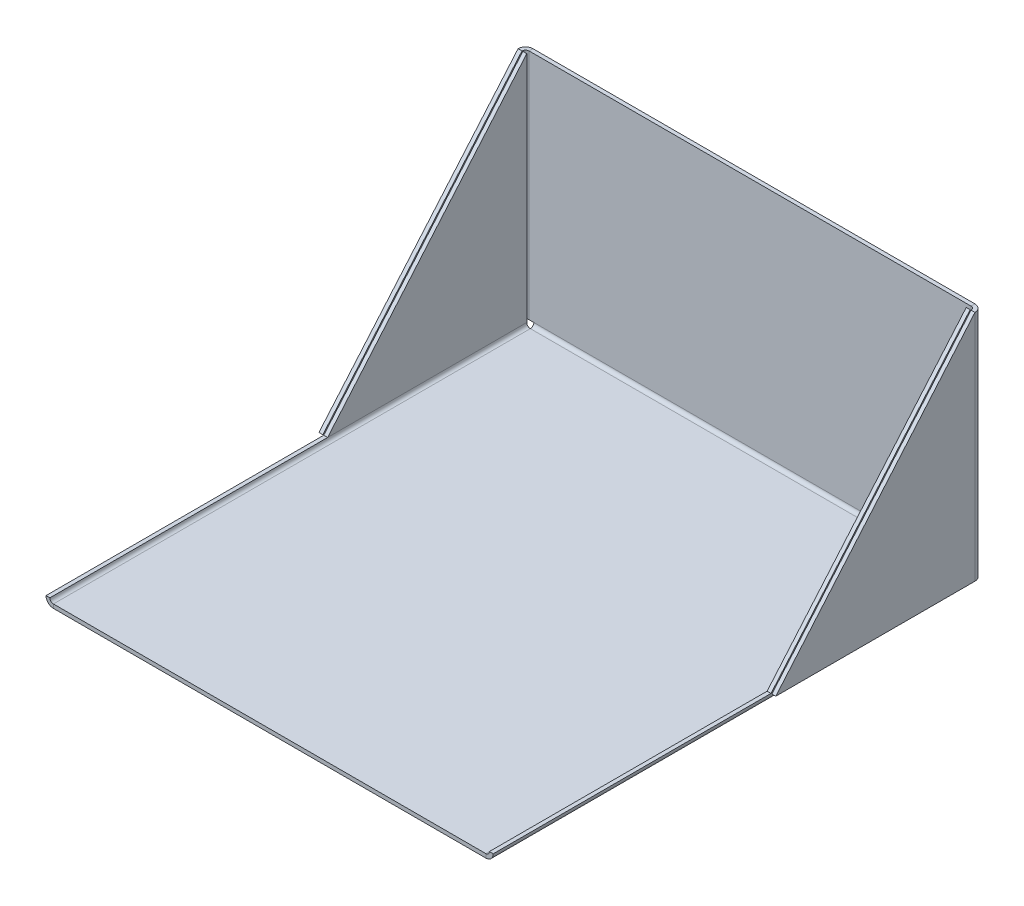
ISO-10303-21;
HEADER;
FILE_DESCRIPTION(('STEP AP214'),'2;1');
FILE_NAME('part.step','',(''),(''),'','','');
FILE_SCHEMA(('AUTOMOTIVE_DESIGN { 1 0 10303 214 1 1 1 1 }'));
ENDSEC;
DATA;
#1=APPLICATION_CONTEXT('core data for automotive mechanical design processes');
#2=APPLICATION_PROTOCOL_DEFINITION('international standard','automotive_design',2000,#1);
#3=PRODUCT_CONTEXT('',#1,'mechanical');
#4=PRODUCT('Part','Part','',(#3));
#5=PRODUCT_RELATED_PRODUCT_CATEGORY('part','',(#4));
#6=PRODUCT_DEFINITION_FORMATION('','',#4);
#7=PRODUCT_DEFINITION_CONTEXT('part definition',#1,'design');
#8=PRODUCT_DEFINITION('design','',#6,#7);
#9=PRODUCT_DEFINITION_SHAPE('','',#8);
#10=(LENGTH_UNIT() NAMED_UNIT(*) SI_UNIT(.MILLI.,.METRE.));
#11=(NAMED_UNIT(*) PLANE_ANGLE_UNIT() SI_UNIT($,.RADIAN.));
#12=(NAMED_UNIT(*) SI_UNIT($,.STERADIAN.) SOLID_ANGLE_UNIT());
#13=UNCERTAINTY_MEASURE_WITH_UNIT(LENGTH_MEASURE(1.E-05),#10,'distance_accuracy_value','');
#14=(GEOMETRIC_REPRESENTATION_CONTEXT(3) GLOBAL_UNCERTAINTY_ASSIGNED_CONTEXT((#13)) GLOBAL_UNIT_ASSIGNED_CONTEXT((#10,
#11,#12)) REPRESENTATION_CONTEXT('',''));
#15=CARTESIAN_POINT('',(0.,0.,0.));
#16=DIRECTION('',(0.,0.,1.));
#17=DIRECTION('',(1.,0.,0.));
#18=AXIS2_PLACEMENT_3D('',#15,#16,#17);
#19=CARTESIAN_POINT('',(-2.54660000000035,0.,0.));
#20=DIRECTION('',(1.,0.,0.));
#21=DIRECTION('',(0.,0.,-1.));
#22=AXIS2_PLACEMENT_3D('',#19,#20,#21);
#23=PLANE('',#22);
#24=DIRECTION('',(0.,0.759861353154798,-0.650085166714147));
#25=VECTOR('',#24,1.);
#26=CARTESIAN_POINT('',(-2.54660000000023,-28.2453762455963,-33.0150123603461));
#27=LINE('',#26,#25);
#28=CARTESIAN_POINT('',(-2.54660000000014,0.736600000000137,-57.8100000000001));
#29=VERTEX_POINT('',#28);
#30=CARTESIAN_POINT('',(-2.5466,49.19,-99.2634000000002));
#31=VERTEX_POINT('',#30);
#32=EDGE_CURVE('E309',#29,#31,#27,.T.);
#33=ORIENTED_EDGE('',*,*,#32,.T.);
#34=DIRECTION('',(0.,-1.,0.));
#35=VECTOR('',#34,1.);
#36=CARTESIAN_POINT('',(-2.5466,49.1900000000001,-99.2634000000002));
#37=LINE('',#36,#35);
#38=CARTESIAN_POINT('',(-2.5466,0.736599999999997,-99.2634000000001));
#39=VERTEX_POINT('',#38);
#40=EDGE_CURVE('E321',#39,#31,#37,.F.);
#41=ORIENTED_EDGE('',*,*,#40,.F.);
#42=DIRECTION('',(0.,0.,1.));
#43=VECTOR('',#42,1.);
#44=CARTESIAN_POINT('',(-2.54660000000035,0.736600000000332,0.));
#45=LINE('',#44,#43);
#46=EDGE_CURVE('E323',#39,#29,#45,.T.);
#47=ORIENTED_EDGE('',*,*,#46,.T.);
#48=EDGE_LOOP('',(#33,#41,#47));
#49=FACE_BOUND('',#48,.T.);
#50=ADVANCED_FACE('F117',(#49),#23,.F.);
#51=CARTESIAN_POINT('',(-1.73660000000035,0.,0.));
#52=DIRECTION('',(1.,0.,0.));
#53=DIRECTION('',(0.,0.,-1.));
#54=AXIS2_PLACEMENT_3D('',#51,#52,#53);
#55=PLANE('',#54);
#56=DIRECTION('',(0.,-1.,0.));
#57=VECTOR('',#56,1.);
#58=CARTESIAN_POINT('',(-1.7366,49.1900000000001,-99.2634000000002));
#59=LINE('',#58,#57);
#60=CARTESIAN_POINT('',(-1.73660000000006,49.19,-99.2634000000002));
#61=VERTEX_POINT('',#60);
#62=CARTESIAN_POINT('',(-1.7366,0.736599999999996,-99.2634000000002));
#63=VERTEX_POINT('',#62);
#64=EDGE_CURVE('E316',#61,#63,#59,.T.);
#65=ORIENTED_EDGE('',*,*,#64,.F.);
#66=DIRECTION('',(0.,0.759861353154798,-0.650085166714147));
#67=VECTOR('',#66,1.);
#68=CARTESIAN_POINT('',(-1.73660000000023,-28.2453762455963,-33.0150123603461));
#69=LINE('',#68,#67);
#70=CARTESIAN_POINT('',(-1.73660000000014,0.736600000000136,-57.8100000000001));
#71=VERTEX_POINT('',#70);
#72=EDGE_CURVE('E312',#71,#61,#69,.T.);
#73=ORIENTED_EDGE('',*,*,#72,.F.);
#74=DIRECTION('',(0.,0.,-1.));
#75=VECTOR('',#74,1.);
#76=CARTESIAN_POINT('',(-1.73660000000014,0.736600000000138,-57.8100000000001));
#77=LINE('',#76,#75);
#78=EDGE_CURVE('E331',#63,#71,#77,.F.);
#79=ORIENTED_EDGE('',*,*,#78,.F.);
#80=EDGE_LOOP('',(#65,#73,#79));
#81=FACE_BOUND('',#80,.T.);
#82=ADVANCED_FACE('F527',(#81),#55,.T.);
#83=CARTESIAN_POINT('',(91.5465999999999,-3.07524396539059E-13,1.02391357888355E-13));
#84=DIRECTION('',(-1.,0.,0.));
#85=DIRECTION('',(0.,-1.,0.));
#86=AXIS2_PLACEMENT_3D('',#83,#84,#85);
#87=PLANE('',#86);
#88=DIRECTION('',(0.,-0.759861353154798,0.650085166714147));
#89=VECTOR('',#88,1.);
#90=CARTESIAN_POINT('',(91.5465999999998,-28.2453762455964,-33.0150123603457));
#91=LINE('',#90,#89);
#92=CARTESIAN_POINT('',(91.5466000000001,49.19,-99.2634000000001));
#93=VERTEX_POINT('',#92);
#94=CARTESIAN_POINT('',(91.5466,0.736600000000137,-57.8099999999998));
#95=VERTEX_POINT('',#94);
#96=EDGE_CURVE('E325',#93,#95,#91,.T.);
#97=ORIENTED_EDGE('',*,*,#96,.T.);
#98=DIRECTION('',(0.,0.,-1.));
#99=VECTOR('',#98,1.);
#100=CARTESIAN_POINT('',(91.5465999999999,0.736600000000001,0.));
#101=LINE('',#100,#99);
#102=CARTESIAN_POINT('',(91.5466,0.736600000000001,-99.2634000000001));
#103=VERTEX_POINT('',#102);
#104=EDGE_CURVE('E561',#103,#95,#101,.F.);
#105=ORIENTED_EDGE('',*,*,#104,.F.);
#106=DIRECTION('',(0.,1.,0.));
#107=VECTOR('',#106,1.);
#108=CARTESIAN_POINT('',(91.5466,-2.79519590637815E-13,-99.2634000000001));
#109=LINE('',#108,#107);
#110=EDGE_CURVE('E429',#103,#93,#109,.T.);
#111=ORIENTED_EDGE('',*,*,#110,.T.);
#112=EDGE_LOOP('',(#97,#105,#111));
#113=FACE_BOUND('',#112,.T.);
#114=ADVANCED_FACE('F585',(#113),#87,.F.);
#115=CARTESIAN_POINT('',(90.7365999999999,-3.04696296654596E-13,1.01485403981934E-13));
#116=DIRECTION('',(-1.,0.,0.));
#117=DIRECTION('',(0.,-1.,0.));
#118=AXIS2_PLACEMENT_3D('',#115,#116,#117);
#119=PLANE('',#118);
#120=DIRECTION('',(0.,0.,-1.));
#121=VECTOR('',#120,1.);
#122=CARTESIAN_POINT('',(90.7365999999999,0.736600000000004,0.));
#123=LINE('',#122,#121);
#124=CARTESIAN_POINT('',(90.7365999999999,0.73660000000014,-57.8099999999998));
#125=VERTEX_POINT('',#124);
#126=CARTESIAN_POINT('',(90.7365999999999,0.736600000000004,-99.2634000000001));
#127=VERTEX_POINT('',#126);
#128=EDGE_CURVE('E424',#125,#127,#123,.T.);
#129=ORIENTED_EDGE('',*,*,#128,.F.);
#130=DIRECTION('',(0.,-0.759861353154798,0.650085166714147));
#131=VECTOR('',#130,1.);
#132=CARTESIAN_POINT('',(90.7365999999998,-28.2453762455964,-33.0150123603457));
#133=LINE('',#132,#131);
#134=CARTESIAN_POINT('',(90.7366000000001,49.19,-99.2634000000001));
#135=VERTEX_POINT('',#134);
#136=EDGE_CURVE('E530',#135,#125,#133,.T.);
#137=ORIENTED_EDGE('',*,*,#136,.F.);
#138=DIRECTION('',(0.,-1.,0.));
#139=VECTOR('',#138,1.);
#140=CARTESIAN_POINT('',(90.7366000000001,49.19,-99.2634000000001));
#141=LINE('',#140,#139);
#142=EDGE_CURVE('E558',#127,#135,#141,.F.);
#143=ORIENTED_EDGE('',*,*,#142,.F.);
#144=EDGE_LOOP('',(#129,#137,#143));
#145=FACE_BOUND('',#144,.T.);
#146=ADVANCED_FACE('F592',(#145),#119,.T.);
#147=CARTESIAN_POINT('',(-1.5466,0.,0.));
#148=DIRECTION('',(1.,0.,0.));
#149=DIRECTION('',(0.,1.,0.));
#150=AXIS2_PLACEMENT_3D('',#147,#148,#149);
#151=PLANE('',#150);
#152=DIRECTION('',(0.,0.759861353154798,-0.650085166714147));
#153=VECTOR('',#152,1.);
#154=CARTESIAN_POINT('',(-1.5465999999999,-28.2453762455963,-33.0150123603461));
#155=LINE('',#154,#153);
#156=CARTESIAN_POINT('',(-1.54660000000009,0.736600000000137,-57.8100000000001));
#157=VERTEX_POINT('',#156);
#158=CARTESIAN_POINT('',(-1.54660000000017,49.19,-99.2634000000001));
#159=VERTEX_POINT('',#158);
#160=EDGE_CURVE('E540',#157,#159,#155,.T.);
#161=ORIENTED_EDGE('',*,*,#160,.T.);
#162=DIRECTION('',(0.,-1.,0.));
#163=VECTOR('',#162,1.);
#164=CARTESIAN_POINT('',(-1.5466,0.,-99.2634000000001));
#165=LINE('',#164,#163);
#166=CARTESIAN_POINT('',(-1.5466,0.736599999999988,-99.2634000000001));
#167=VERTEX_POINT('',#166);
#168=EDGE_CURVE('E437',#159,#167,#165,.T.);
#169=ORIENTED_EDGE('',*,*,#168,.T.);
#170=DIRECTION('',(0.,0.,1.));
#171=VECTOR('',#170,1.);
#172=CARTESIAN_POINT('',(-1.5466,0.736599999999989,-99.2634000000001));
#173=LINE('',#172,#171);
#174=EDGE_CURVE('E446',#157,#167,#173,.F.);
#175=ORIENTED_EDGE('',*,*,#174,.F.);
#176=EDGE_LOOP('',(#161,#169,#175));
#177=FACE_BOUND('',#176,.T.);
#178=ADVANCED_FACE('F594',(#177),#151,.F.);
#179=CARTESIAN_POINT('',(-0.736599999999997,0.,0.));
#180=DIRECTION('',(1.,0.,0.));
#181=DIRECTION('',(0.,1.,0.));
#182=AXIS2_PLACEMENT_3D('',#179,#180,#181);
#183=PLANE('',#182);
#184=DIRECTION('',(0.,1.,0.));
#185=VECTOR('',#184,1.);
#186=CARTESIAN_POINT('',(-0.736599999999997,0.,-99.2634000000001));
#187=LINE('',#186,#185);
#188=CARTESIAN_POINT('',(-0.736600000000169,49.19,-99.2634000000001));
#189=VERTEX_POINT('',#188);
#190=CARTESIAN_POINT('',(-0.7366,0.736599999999991,-99.2634000000001));
#191=VERTEX_POINT('',#190);
#192=EDGE_CURVE('E440',#189,#191,#187,.F.);
#193=ORIENTED_EDGE('',*,*,#192,.F.);
#194=DIRECTION('',(0.,0.759861353154798,-0.650085166714147));
#195=VECTOR('',#194,1.);
#196=CARTESIAN_POINT('',(-0.736599999999899,-28.2453762455963,-33.0150123603461));
#197=LINE('',#196,#195);
#198=CARTESIAN_POINT('',(-0.7366,0.73660000000014,-57.8100000000001));
#199=VERTEX_POINT('',#198);
#200=EDGE_CURVE('E541',#199,#189,#197,.T.);
#201=ORIENTED_EDGE('',*,*,#200,.F.);
#202=DIRECTION('',(0.,0.,1.));
#203=VECTOR('',#202,1.);
#204=CARTESIAN_POINT('',(-0.7366,0.736599999999992,-99.2634000000001));
#205=LINE('',#204,#203);
#206=EDGE_CURVE('E450',#191,#199,#205,.T.);
#207=ORIENTED_EDGE('',*,*,#206,.F.);
#208=EDGE_LOOP('',(#193,#201,#207));
#209=FACE_BOUND('',#208,.T.);
#210=ADVANCED_FACE('F600',(#209),#183,.T.);
#211=CARTESIAN_POINT('',(92.5466000000003,0.,-3.28474222893147E-13));
#212=DIRECTION('',(-1.,0.,0.));
#213=DIRECTION('',(0.,0.,1.));
#214=AXIS2_PLACEMENT_3D('',#211,#212,#213);
#215=PLANE('',#214);
#216=DIRECTION('',(0.,-0.759861353154798,0.650085166714147));
#217=VECTOR('',#216,1.);
#218=CARTESIAN_POINT('',(92.5466000000002,-28.245376245596,-33.015012360346));
#219=LINE('',#218,#217);
#220=CARTESIAN_POINT('',(92.5466,49.19,-99.2633999999998));
#221=VERTEX_POINT('',#220);
#222=CARTESIAN_POINT('',(92.5466000000001,0.736600000000141,-57.8100000000001));
#223=VERTEX_POINT('',#222);
#224=EDGE_CURVE('E551',#221,#223,#219,.T.);
#225=ORIENTED_EDGE('',*,*,#224,.T.);
#226=DIRECTION('',(0.,0.,-1.));
#227=VECTOR('',#226,1.);
#228=CARTESIAN_POINT('',(92.5466000000003,0.73660000000034,-3.31005058112816E-13));
#229=LINE('',#228,#227);
#230=CARTESIAN_POINT('',(92.5466,0.736599999999997,-99.2634000000002));
#231=VERTEX_POINT('',#230);
#232=EDGE_CURVE('E473',#223,#231,#229,.T.);
#233=ORIENTED_EDGE('',*,*,#232,.T.);
#234=DIRECTION('',(0.,1.,0.));
#235=VECTOR('',#234,1.);
#236=CARTESIAN_POINT('',(92.5466,0.736600000000069,-99.2634000000001));
#237=LINE('',#236,#235);
#238=EDGE_CURVE('E479',#221,#231,#237,.F.);
#239=ORIENTED_EDGE('',*,*,#238,.F.);
#240=EDGE_LOOP('',(#225,#233,#239));
#241=FACE_BOUND('',#240,.T.);
#242=ADVANCED_FACE('F709',(#241),#215,.F.);
#243=CARTESIAN_POINT('',(91.7366000000003,0.,-3.25646123008684E-13));
#244=DIRECTION('',(-1.,0.,0.));
#245=DIRECTION('',(0.,0.,1.));
#246=AXIS2_PLACEMENT_3D('',#243,#244,#245);
#247=PLANE('',#246);
#248=DIRECTION('',(0.,0.,1.));
#249=VECTOR('',#248,1.);
#250=CARTESIAN_POINT('',(91.7366,0.736599999999996,-100.));
#251=LINE('',#250,#249);
#252=CARTESIAN_POINT('',(91.7366000000001,0.736600000000141,-57.8100000000001));
#253=VERTEX_POINT('',#252);
#254=CARTESIAN_POINT('',(91.7366,0.736599999999997,-99.2634000000002));
#255=VERTEX_POINT('',#254);
#256=EDGE_CURVE('E476',#253,#255,#251,.F.);
#257=ORIENTED_EDGE('',*,*,#256,.F.);
#258=DIRECTION('',(0.,-0.759861353154798,0.650085166714147));
#259=VECTOR('',#258,1.);
#260=CARTESIAN_POINT('',(91.7366000000002,-28.245376245596,-33.015012360346));
#261=LINE('',#260,#259);
#262=CARTESIAN_POINT('',(91.7366,49.19,-99.2633999999998));
#263=VERTEX_POINT('',#262);
#264=EDGE_CURVE('E550',#263,#253,#261,.T.);
#265=ORIENTED_EDGE('',*,*,#264,.F.);
#266=DIRECTION('',(0.,1.,0.));
#267=VECTOR('',#266,1.);
#268=CARTESIAN_POINT('',(91.7366,0.736600000000069,-99.2634000000001));
#269=LINE('',#268,#267);
#270=EDGE_CURVE('E484',#255,#263,#269,.T.);
#271=ORIENTED_EDGE('',*,*,#270,.F.);
#272=EDGE_LOOP('',(#257,#265,#271));
#273=FACE_BOUND('',#272,.T.);
#274=ADVANCED_FACE('F658',(#273),#247,.T.);
#275=CARTESIAN_POINT('',(0.,-0.81,0.));
#276=DIRECTION('',(0.,-1.,0.));
#277=DIRECTION('',(0.,0.,-1.));
#278=AXIS2_PLACEMENT_3D('',#275,#276,#277);
#279=PLANE('',#278);
#280=DIRECTION('',(0.,0.,1.));
#281=VECTOR('',#280,1.);
#282=CARTESIAN_POINT('',(0.,-0.81,0.));
#283=LINE('',#282,#281);
#284=CARTESIAN_POINT('',(0.,-0.810000000000005,-99.2634000000001));
#285=VERTEX_POINT('',#284);
#286=CARTESIAN_POINT('',(0.,-0.809999999999996,0.));
#287=VERTEX_POINT('',#286);
#288=EDGE_CURVE('E394',#285,#287,#283,.T.);
#289=ORIENTED_EDGE('',*,*,#288,.F.);
#290=DIRECTION('',(-1.,0.,0.));
#291=VECTOR('',#290,1.);
#292=CARTESIAN_POINT('',(0.,-0.810000000000005,-99.2634000000001));
#293=LINE('',#292,#291);
#294=CARTESIAN_POINT('',(90.0000000000001,-0.809999999999942,-99.2634000000001));
#295=VERTEX_POINT('',#294);
#296=EDGE_CURVE('E153',#285,#295,#293,.F.);
#297=ORIENTED_EDGE('',*,*,#296,.T.);
#298=DIRECTION('',(0.,0.,-1.));
#299=VECTOR('',#298,1.);
#300=CARTESIAN_POINT('',(89.9999999999999,-0.81,0.));
#301=LINE('',#300,#299);
#302=CARTESIAN_POINT('',(89.9999999999999,-0.81,0.));
#303=VERTEX_POINT('',#302);
#304=EDGE_CURVE('E133',#303,#295,#301,.T.);
#305=ORIENTED_EDGE('',*,*,#304,.F.);
#306=DIRECTION('',(1.,0.,0.));
#307=VECTOR('',#306,1.);
#308=CARTESIAN_POINT('',(0.,-0.81,0.));
#309=LINE('',#308,#307);
#310=EDGE_CURVE('E397',#287,#303,#309,.T.);
#311=ORIENTED_EDGE('',*,*,#310,.F.);
#312=EDGE_LOOP('',(#289,#297,#305,#311));
#313=FACE_BOUND('',#312,.T.);
#314=ADVANCED_FACE('F656',(#313),#279,.T.);
#315=CARTESIAN_POINT('',(0.,0.,0.));
#316=DIRECTION('',(0.,-1.,0.));
#317=DIRECTION('',(0.,0.,-1.));
#318=AXIS2_PLACEMENT_3D('',#315,#316,#317);
#319=PLANE('',#318);
#320=DIRECTION('',(-1.,0.,0.));
#321=VECTOR('',#320,1.);
#322=CARTESIAN_POINT('',(0.,0.,-99.2634000000001));
#323=LINE('',#322,#321);
#324=CARTESIAN_POINT('',(0.,0.,-99.2634000000001));
#325=VERTEX_POINT('',#324);
#326=CARTESIAN_POINT('',(90.,0.,-99.2634000000001));
#327=VERTEX_POINT('',#326);
#328=EDGE_CURVE('E163',#325,#327,#323,.F.);
#329=ORIENTED_EDGE('',*,*,#328,.F.);
#330=DIRECTION('',(0.,0.,1.));
#331=VECTOR('',#330,1.);
#332=CARTESIAN_POINT('',(0.,0.,0.));
#333=LINE('',#332,#331);
#334=CARTESIAN_POINT('',(0.,0.,0.));
#335=VERTEX_POINT('',#334);
#336=EDGE_CURVE('E145',#325,#335,#333,.T.);
#337=ORIENTED_EDGE('',*,*,#336,.T.);
#338=DIRECTION('',(1.,0.,0.));
#339=VECTOR('',#338,1.);
#340=CARTESIAN_POINT('',(0.,0.,0.));
#341=LINE('',#340,#339);
#342=CARTESIAN_POINT('',(89.9999999999999,0.,0.));
#343=VERTEX_POINT('',#342);
#344=EDGE_CURVE('E402',#335,#343,#341,.T.);
#345=ORIENTED_EDGE('',*,*,#344,.T.);
#346=DIRECTION('',(0.,0.,-1.));
#347=VECTOR('',#346,1.);
#348=CARTESIAN_POINT('',(89.9999999999999,0.,0.));
#349=LINE('',#348,#347);
#350=EDGE_CURVE('E398',#343,#327,#349,.T.);
#351=ORIENTED_EDGE('',*,*,#350,.T.);
#352=EDGE_LOOP('',(#329,#337,#345,#351));
#353=FACE_BOUND('',#352,.T.);
#354=ADVANCED_FACE('F407',(#353),#319,.F.);
#355=CARTESIAN_POINT('',(0.,-0.81,0.));
#356=DIRECTION('',(0.,0.,1.));
#357=DIRECTION('',(1.,0.,0.));
#358=AXIS2_PLACEMENT_3D('',#355,#356,#357);
#359=PLANE('',#358);
#360=ORIENTED_EDGE('',*,*,#344,.F.);
#361=DIRECTION('',(0.,1.,0.));
#362=VECTOR('',#361,1.);
#363=CARTESIAN_POINT('',(0.,-0.81,0.));
#364=LINE('',#363,#362);
#365=EDGE_CURVE('E121',#287,#335,#364,.T.);
#366=ORIENTED_EDGE('',*,*,#365,.F.);
#367=ORIENTED_EDGE('',*,*,#310,.T.);
#368=DIRECTION('',(0.,1.,0.));
#369=VECTOR('',#368,1.);
#370=CARTESIAN_POINT('',(89.9999999999999,-0.81,0.));
#371=LINE('',#370,#369);
#372=EDGE_CURVE('E13',#303,#343,#371,.T.);
#373=ORIENTED_EDGE('',*,*,#372,.T.);
#374=EDGE_LOOP('',(#360,#366,#367,#373));
#375=FACE_BOUND('',#374,.T.);
#376=ADVANCED_FACE('F119',(#375),#359,.T.);
#377=CARTESIAN_POINT('',(90.,0.736599999999999,-99.2634000000001));
#378=DIRECTION('',(1.,0.,0.));
#379=DIRECTION('',(0.,0.,-1.));
#380=AXIS2_PLACEMENT_3D('',#377,#378,#379);
#381=PLANE('',#380);
#382=DIRECTION('',(0.,0.,-1.));
#383=VECTOR('',#382,1.);
#384=CARTESIAN_POINT('',(90.,0.736600000000004,-100.));
#385=LINE('',#384,#383);
#386=CARTESIAN_POINT('',(90.,0.736599999999997,-100.));
#387=VERTEX_POINT('',#386);
#388=CARTESIAN_POINT('',(90.,0.736599999999994,-100.81));
#389=VERTEX_POINT('',#388);
#390=EDGE_CURVE('E364',#387,#389,#385,.T.);
#391=ORIENTED_EDGE('',*,*,#390,.F.);
#392=CARTESIAN_POINT('',(90.,0.736599999999999,-99.2634000000001));
#393=DIRECTION('',(-1.,0.,0.));
#394=DIRECTION('',(0.,0.,1.));
#395=AXIS2_PLACEMENT_3D('',#392,#393,#394);
#396=CIRCLE('',#395,0.736600000000004);
#397=EDGE_CURVE('E386',#327,#387,#396,.F.);
#398=ORIENTED_EDGE('',*,*,#397,.F.);
#399=DIRECTION('',(0.,-1.,0.));
#400=VECTOR('',#399,1.);
#401=CARTESIAN_POINT('',(90.,0.,-99.2634000000001));
#402=LINE('',#401,#400);
#403=EDGE_CURVE('E390',#327,#295,#402,.T.);
#404=ORIENTED_EDGE('',*,*,#403,.T.);
#405=CARTESIAN_POINT('',(90.,0.736599999999999,-99.2634000000001));
#406=DIRECTION('',(-1.,0.,0.));
#407=DIRECTION('',(0.,0.,1.));
#408=AXIS2_PLACEMENT_3D('',#405,#406,#407);
#409=CIRCLE('',#408,1.5466);
#410=EDGE_CURVE('E381',#295,#389,#409,.F.);
#411=ORIENTED_EDGE('',*,*,#410,.T.);
#412=EDGE_LOOP('',(#391,#398,#404,#411));
#413=FACE_BOUND('',#412,.T.);
#414=ADVANCED_FACE('F651',(#413),#381,.T.);
#415=CARTESIAN_POINT('',(0.,0.736599999999999,-99.2634000000001));
#416=DIRECTION('',(1.,0.,0.));
#417=DIRECTION('',(0.,0.,-1.));
#418=AXIS2_PLACEMENT_3D('',#415,#416,#417);
#419=PLANE('',#418);
#420=CARTESIAN_POINT('',(0.,0.736599999999999,-99.2634000000001));
#421=DIRECTION('',(-1.,0.,0.));
#422=DIRECTION('',(0.,0.,1.));
#423=AXIS2_PLACEMENT_3D('',#420,#421,#422);
#424=CIRCLE('',#423,0.736600000000004);
#425=CARTESIAN_POINT('',(0.,0.736599999999997,-100.));
#426=VERTEX_POINT('',#425);
#427=EDGE_CURVE('E377',#426,#325,#424,.T.);
#428=ORIENTED_EDGE('',*,*,#427,.F.);
#429=DIRECTION('',(0.,0.,-1.));
#430=VECTOR('',#429,1.);
#431=CARTESIAN_POINT('',(0.,0.736600000000004,-100.));
#432=LINE('',#431,#430);
#433=CARTESIAN_POINT('',(0.,0.736599999999997,-100.81));
#434=VERTEX_POINT('',#433);
#435=EDGE_CURVE('E366',#426,#434,#432,.T.);
#436=ORIENTED_EDGE('',*,*,#435,.T.);
#437=CARTESIAN_POINT('',(0.,0.736599999999999,-99.2634000000001));
#438=DIRECTION('',(-1.,0.,0.));
#439=DIRECTION('',(0.,0.,1.));
#440=AXIS2_PLACEMENT_3D('',#437,#438,#439);
#441=CIRCLE('',#440,1.5466);
#442=EDGE_CURVE('E382',#434,#285,#441,.T.);
#443=ORIENTED_EDGE('',*,*,#442,.T.);
#444=DIRECTION('',(0.,-1.,0.));
#445=VECTOR('',#444,1.);
#446=CARTESIAN_POINT('',(0.,0.,-99.2634000000001));
#447=LINE('',#446,#445);
#448=EDGE_CURVE('E170',#325,#285,#447,.T.);
#449=ORIENTED_EDGE('',*,*,#448,.F.);
#450=EDGE_LOOP('',(#428,#436,#443,#449));
#451=FACE_BOUND('',#450,.T.);
#452=ADVANCED_FACE('F648',(#451),#419,.F.);
#453=CARTESIAN_POINT('',(0.,0.736599999999999,-99.2634000000001));
#454=DIRECTION('',(-1.,0.,0.));
#455=DIRECTION('',(0.,0.,-1.));
#456=AXIS2_PLACEMENT_3D('',#453,#454,#455);
#457=CYLINDRICAL_SURFACE('',#456,1.5466);
#458=ORIENTED_EDGE('',*,*,#296,.F.);
#459=ORIENTED_EDGE('',*,*,#442,.F.);
#460=DIRECTION('',(1.,0.,0.));
#461=VECTOR('',#460,1.);
#462=CARTESIAN_POINT('',(0.,0.73660000000001,-100.81));
#463=LINE('',#462,#461);
#464=EDGE_CURVE('E369',#434,#389,#463,.T.);
#465=ORIENTED_EDGE('',*,*,#464,.T.);
#466=ORIENTED_EDGE('',*,*,#410,.F.);
#467=EDGE_LOOP('',(#458,#459,#465,#466));
#468=FACE_BOUND('',#467,.T.);
#469=ADVANCED_FACE('F645',(#468),#457,.T.);
#470=CARTESIAN_POINT('',(0.,0.736599999999999,-99.2634000000001));
#471=DIRECTION('',(-1.,0.,0.));
#472=DIRECTION('',(0.,0.,-1.));
#473=AXIS2_PLACEMENT_3D('',#470,#471,#472);
#474=CYLINDRICAL_SURFACE('',#473,0.736600000000004);
#475=ORIENTED_EDGE('',*,*,#328,.T.);
#476=ORIENTED_EDGE('',*,*,#397,.T.);
#477=DIRECTION('',(-1.,0.,0.));
#478=VECTOR('',#477,1.);
#479=CARTESIAN_POINT('',(90.,0.736600000000004,-100.));
#480=LINE('',#479,#478);
#481=EDGE_CURVE('E197',#387,#426,#480,.T.);
#482=ORIENTED_EDGE('',*,*,#481,.T.);
#483=ORIENTED_EDGE('',*,*,#427,.T.);
#484=EDGE_LOOP('',(#475,#476,#482,#483));
#485=FACE_BOUND('',#484,.T.);
#486=ADVANCED_FACE('F638',(#485),#474,.F.);
#487=CARTESIAN_POINT('',(0.,-3.41379540611793E-13,-100.81));
#488=DIRECTION('',(0.,0.,1.));
#489=DIRECTION('',(0.,-1.,0.));
#490=AXIS2_PLACEMENT_3D('',#487,#488,#489);
#491=PLANE('',#490);
#492=ORIENTED_EDGE('',*,*,#464,.F.);
#493=DIRECTION('',(1.,0.,0.));
#494=VECTOR('',#493,1.);
#495=CARTESIAN_POINT('',(-1.,0.736599999999996,-100.81));
#496=LINE('',#495,#494);
#497=CARTESIAN_POINT('',(-1.,0.736599999999996,-100.81));
#498=VERTEX_POINT('',#497);
#499=EDGE_CURVE('E178',#498,#434,#496,.T.);
#500=ORIENTED_EDGE('',*,*,#499,.F.);
#501=DIRECTION('',(0.,-1.,0.));
#502=VECTOR('',#501,1.);
#503=CARTESIAN_POINT('',(-1.,0.736599999999997,-100.81));
#504=LINE('',#503,#502);
#505=CARTESIAN_POINT('',(-1.,49.19,-100.81));
#506=VERTEX_POINT('',#505);
#507=EDGE_CURVE('E339',#498,#506,#504,.F.);
#508=ORIENTED_EDGE('',*,*,#507,.T.);
#509=DIRECTION('',(1.,0.,0.));
#510=VECTOR('',#509,1.);
#511=CARTESIAN_POINT('',(90.,49.19,-100.81));
#512=LINE('',#511,#510);
#513=CARTESIAN_POINT('',(91.,49.19,-100.81));
#514=VERTEX_POINT('',#513);
#515=EDGE_CURVE('E374',#506,#514,#512,.T.);
#516=ORIENTED_EDGE('',*,*,#515,.T.);
#517=DIRECTION('',(0.,1.,0.));
#518=VECTOR('',#517,1.);
#519=CARTESIAN_POINT('',(91.,49.19,-100.81));
#520=LINE('',#519,#518);
#521=CARTESIAN_POINT('',(91.,0.736599999999997,-100.81));
#522=VERTEX_POINT('',#521);
#523=EDGE_CURVE('E489',#514,#522,#520,.F.);
#524=ORIENTED_EDGE('',*,*,#523,.T.);
#525=DIRECTION('',(-1.,0.,0.));
#526=VECTOR('',#525,1.);
#527=CARTESIAN_POINT('',(91.,0.736599999999997,-100.81));
#528=LINE('',#527,#526);
#529=EDGE_CURVE('E356',#522,#389,#528,.T.);
#530=ORIENTED_EDGE('',*,*,#529,.T.);
#531=EDGE_LOOP('',(#492,#500,#508,#516,#524,#530));
#532=FACE_BOUND('',#531,.T.);
#533=ADVANCED_FACE('F634',(#532),#491,.F.);
#534=CARTESIAN_POINT('',(0.,-3.3855144072733E-13,-100.));
#535=DIRECTION('',(0.,0.,1.));
#536=DIRECTION('',(0.,-1.,0.));
#537=AXIS2_PLACEMENT_3D('',#534,#535,#536);
#538=PLANE('',#537);
#539=DIRECTION('',(1.,0.,0.));
#540=VECTOR('',#539,1.);
#541=CARTESIAN_POINT('',(90.,49.19,-100.));
#542=LINE('',#541,#540);
#543=CARTESIAN_POINT('',(-1.,49.19,-100.));
#544=VERTEX_POINT('',#543);
#545=CARTESIAN_POINT('',(91.,49.19,-100.));
#546=VERTEX_POINT('',#545);
#547=EDGE_CURVE('E373',#544,#546,#542,.T.);
#548=ORIENTED_EDGE('',*,*,#547,.F.);
#549=DIRECTION('',(0.,-1.,0.));
#550=VECTOR('',#549,1.);
#551=CARTESIAN_POINT('',(-1.,0.736599999999997,-100.));
#552=LINE('',#551,#550);
#553=CARTESIAN_POINT('',(-1.,0.736599999999996,-100.));
#554=VERTEX_POINT('',#553);
#555=EDGE_CURVE('E348',#554,#544,#552,.F.);
#556=ORIENTED_EDGE('',*,*,#555,.F.);
#557=DIRECTION('',(1.,0.,0.));
#558=VECTOR('',#557,1.);
#559=CARTESIAN_POINT('',(-1.,0.736599999999996,-100.));
#560=LINE('',#559,#558);
#561=EDGE_CURVE('E362',#554,#426,#560,.T.);
#562=ORIENTED_EDGE('',*,*,#561,.T.);
#563=ORIENTED_EDGE('',*,*,#481,.F.);
#564=DIRECTION('',(-1.,0.,0.));
#565=VECTOR('',#564,1.);
#566=CARTESIAN_POINT('',(91.,0.736599999999997,-100.));
#567=LINE('',#566,#565);
#568=CARTESIAN_POINT('',(91.,0.736599999999997,-100.));
#569=VERTEX_POINT('',#568);
#570=EDGE_CURVE('E354',#569,#387,#567,.T.);
#571=ORIENTED_EDGE('',*,*,#570,.F.);
#572=DIRECTION('',(0.,1.,0.));
#573=VECTOR('',#572,1.);
#574=CARTESIAN_POINT('',(91.,49.19,-100.));
#575=LINE('',#574,#573);
#576=EDGE_CURVE('E502',#546,#569,#575,.F.);
#577=ORIENTED_EDGE('',*,*,#576,.F.);
#578=EDGE_LOOP('',(#548,#556,#562,#563,#571,#577));
#579=FACE_BOUND('',#578,.T.);
#580=ADVANCED_FACE('F637',(#579),#538,.T.);
#581=CARTESIAN_POINT('',(90.,49.19,-100.81));
#582=DIRECTION('',(0.,-1.,0.));
#583=DIRECTION('',(0.,0.,-1.));
#584=AXIS2_PLACEMENT_3D('',#581,#582,#583);
#585=PLANE('',#584);
#586=ORIENTED_EDGE('',*,*,#547,.T.);
#587=DIRECTION('',(0.,0.,-1.));
#588=VECTOR('',#587,1.);
#589=CARTESIAN_POINT('',(91.,49.19,-100.));
#590=LINE('',#589,#588);
#591=EDGE_CURVE('E496',#546,#514,#590,.T.);
#592=ORIENTED_EDGE('',*,*,#591,.T.);
#593=ORIENTED_EDGE('',*,*,#515,.F.);
#594=DIRECTION('',(0.,0.,-1.));
#595=VECTOR('',#594,1.);
#596=CARTESIAN_POINT('',(-1.,49.19,-100.));
#597=LINE('',#596,#595);
#598=EDGE_CURVE('E336',#544,#506,#597,.T.);
#599=ORIENTED_EDGE('',*,*,#598,.F.);
#600=EDGE_LOOP('',(#586,#592,#593,#599));
#601=FACE_BOUND('',#600,.T.);
#602=ADVANCED_FACE('F633',(#601),#585,.F.);
#603=CARTESIAN_POINT('',(-1.,0.736599999999996,-100.));
#604=DIRECTION('',(0.,-1.,0.));
#605=DIRECTION('',(0.,0.,-1.));
#606=AXIS2_PLACEMENT_3D('',#603,#604,#605);
#607=PLANE('',#606);
#608=ORIENTED_EDGE('',*,*,#561,.F.);
#609=DIRECTION('',(0.,0.,-1.));
#610=VECTOR('',#609,1.);
#611=CARTESIAN_POINT('',(-1.,0.736599999999996,-100.));
#612=LINE('',#611,#610);
#613=EDGE_CURVE('E338',#554,#498,#612,.T.);
#614=ORIENTED_EDGE('',*,*,#613,.T.);
#615=ORIENTED_EDGE('',*,*,#499,.T.);
#616=ORIENTED_EDGE('',*,*,#435,.F.);
#617=EDGE_LOOP('',(#608,#614,#615,#616));
#618=FACE_BOUND('',#617,.T.);
#619=ADVANCED_FACE('F629',(#618),#607,.T.);
#620=CARTESIAN_POINT('',(91.,0.736599999999997,-100.));
#621=DIRECTION('',(0.,1.,0.));
#622=DIRECTION('',(0.,0.,-1.));
#623=AXIS2_PLACEMENT_3D('',#620,#621,#622);
#624=PLANE('',#623);
#625=ORIENTED_EDGE('',*,*,#529,.F.);
#626=DIRECTION('',(0.,0.,-1.));
#627=VECTOR('',#626,1.);
#628=CARTESIAN_POINT('',(91.,0.736599999999997,-100.));
#629=LINE('',#628,#627);
#630=EDGE_CURVE('E317',#569,#522,#629,.T.);
#631=ORIENTED_EDGE('',*,*,#630,.F.);
#632=ORIENTED_EDGE('',*,*,#570,.T.);
#633=ORIENTED_EDGE('',*,*,#390,.T.);
#634=EDGE_LOOP('',(#625,#631,#632,#633));
#635=FACE_BOUND('',#634,.T.);
#636=ADVANCED_FACE('F624',(#635),#624,.F.);
#637=CARTESIAN_POINT('',(-1.,49.19,-99.2634000000002));
#638=DIRECTION('',(0.,1.,0.));
#639=DIRECTION('',(0.,0.,1.));
#640=AXIS2_PLACEMENT_3D('',#637,#638,#639);
#641=PLANE('',#640);
#642=DIRECTION('',(1.,0.,0.));
#643=VECTOR('',#642,1.);
#644=CARTESIAN_POINT('',(-2.5466,49.19,-99.2634000000002));
#645=LINE('',#644,#643);
#646=EDGE_CURVE('E306',#61,#31,#645,.F.);
#647=ORIENTED_EDGE('',*,*,#646,.F.);
#648=CARTESIAN_POINT('',(-1.,49.19,-99.2634000000002));
#649=DIRECTION('',(0.,-1.,0.));
#650=DIRECTION('',(0.,0.,-1.));
#651=AXIS2_PLACEMENT_3D('',#648,#649,#650);
#652=CIRCLE('',#651,0.7366);
#653=EDGE_CURVE('E346',#544,#61,#652,.F.);
#654=ORIENTED_EDGE('',*,*,#653,.F.);
#655=ORIENTED_EDGE('',*,*,#598,.T.);
#656=CARTESIAN_POINT('',(-1.,49.19,-99.2634000000002));
#657=DIRECTION('',(0.,-1.,0.));
#658=DIRECTION('',(0.,0.,-1.));
#659=AXIS2_PLACEMENT_3D('',#656,#657,#658);
#660=CIRCLE('',#659,1.5466);
#661=EDGE_CURVE('E191',#506,#31,#660,.F.);
#662=ORIENTED_EDGE('',*,*,#661,.T.);
#663=EDGE_LOOP('',(#647,#654,#655,#662));
#664=FACE_BOUND('',#663,.T.);
#665=ADVANCED_FACE('F334',(#664),#641,.T.);
#666=CARTESIAN_POINT('',(-1.,0.736599999999996,-99.2634000000002));
#667=DIRECTION('',(0.,1.,0.));
#668=DIRECTION('',(0.,0.,1.));
#669=AXIS2_PLACEMENT_3D('',#666,#667,#668);
#670=PLANE('',#669);
#671=CARTESIAN_POINT('',(-1.,0.736599999999996,-99.2634000000002));
#672=DIRECTION('',(0.,-1.,0.));
#673=DIRECTION('',(0.,0.,-1.));
#674=AXIS2_PLACEMENT_3D('',#671,#672,#673);
#675=CIRCLE('',#674,0.7366);
#676=EDGE_CURVE('E350',#63,#554,#675,.T.);
#677=ORIENTED_EDGE('',*,*,#676,.F.);
#678=DIRECTION('',(1.,0.,0.));
#679=VECTOR('',#678,1.);
#680=CARTESIAN_POINT('',(-1.7366,0.736599999999997,-99.2634000000001));
#681=LINE('',#680,#679);
#682=EDGE_CURVE('E332',#63,#39,#681,.F.);
#683=ORIENTED_EDGE('',*,*,#682,.T.);
#684=CARTESIAN_POINT('',(-1.,0.736599999999996,-99.2634000000002));
#685=DIRECTION('',(0.,-1.,0.));
#686=DIRECTION('',(0.,0.,-1.));
#687=AXIS2_PLACEMENT_3D('',#684,#685,#686);
#688=CIRCLE('',#687,1.5466);
#689=EDGE_CURVE('E329',#39,#498,#688,.T.);
#690=ORIENTED_EDGE('',*,*,#689,.T.);
#691=ORIENTED_EDGE('',*,*,#613,.F.);
#692=EDGE_LOOP('',(#677,#683,#690,#691));
#693=FACE_BOUND('',#692,.T.);
#694=ADVANCED_FACE('F524',(#693),#670,.F.);
#695=CARTESIAN_POINT('',(-1.,0.736599999999997,-99.2634000000002));
#696=DIRECTION('',(0.,-1.,0.));
#697=DIRECTION('',(-1.,0.,0.));
#698=AXIS2_PLACEMENT_3D('',#695,#696,#697);
#699=CYLINDRICAL_SURFACE('',#698,1.5466);
#700=ORIENTED_EDGE('',*,*,#507,.F.);
#701=ORIENTED_EDGE('',*,*,#689,.F.);
#702=ORIENTED_EDGE('',*,*,#40,.T.);
#703=ORIENTED_EDGE('',*,*,#661,.F.);
#704=EDGE_LOOP('',(#700,#701,#702,#703));
#705=FACE_BOUND('',#704,.T.);
#706=ADVANCED_FACE('F327',(#705),#699,.T.);
#707=CARTESIAN_POINT('',(-1.,0.736599999999997,-99.2634000000002));
#708=DIRECTION('',(0.,-1.,0.));
#709=DIRECTION('',(-1.,0.,0.));
#710=AXIS2_PLACEMENT_3D('',#707,#708,#709);
#711=CYLINDRICAL_SURFACE('',#710,0.7366);
#712=ORIENTED_EDGE('',*,*,#555,.T.);
#713=ORIENTED_EDGE('',*,*,#653,.T.);
#714=ORIENTED_EDGE('',*,*,#64,.T.);
#715=ORIENTED_EDGE('',*,*,#676,.T.);
#716=EDGE_LOOP('',(#712,#713,#714,#715));
#717=FACE_BOUND('',#716,.T.);
#718=ADVANCED_FACE('F518',(#717),#711,.F.);
#719=CARTESIAN_POINT('',(-2.54660000000014,0.736600000000138,-57.8100000000001));
#720=DIRECTION('',(0.,1.,0.));
#721=DIRECTION('',(0.,0.,1.));
#722=AXIS2_PLACEMENT_3D('',#719,#720,#721);
#723=PLANE('',#722);
#724=ORIENTED_EDGE('',*,*,#682,.F.);
#725=ORIENTED_EDGE('',*,*,#78,.T.);
#726=DIRECTION('',(1.,0.,0.));
#727=VECTOR('',#726,1.);
#728=CARTESIAN_POINT('',(-2.54660000000014,0.736600000000136,-57.8100000000001));
#729=LINE('',#728,#727);
#730=EDGE_CURVE('E353',#29,#71,#729,.T.);
#731=ORIENTED_EDGE('',*,*,#730,.F.);
#732=ORIENTED_EDGE('',*,*,#46,.F.);
#733=EDGE_LOOP('',(#724,#725,#731,#732));
#734=FACE_BOUND('',#733,.T.);
#735=ADVANCED_FACE('F526',(#734),#723,.F.);
#736=CARTESIAN_POINT('',(91.,0.736599999999997,-99.2634000000002));
#737=DIRECTION('',(0.,-1.,0.));
#738=DIRECTION('',(0.,0.,-1.));
#739=AXIS2_PLACEMENT_3D('',#736,#737,#738);
#740=PLANE('',#739);
#741=DIRECTION('',(-1.,0.,0.));
#742=VECTOR('',#741,1.);
#743=CARTESIAN_POINT('',(92.5466,0.736599999999999,-99.2634000000001));
#744=LINE('',#743,#742);
#745=EDGE_CURVE('E460',#255,#231,#744,.F.);
#746=ORIENTED_EDGE('',*,*,#745,.F.);
#747=CARTESIAN_POINT('',(91.,0.736599999999997,-99.2634000000002));
#748=DIRECTION('',(0.,1.,0.));
#749=DIRECTION('',(0.,0.,1.));
#750=AXIS2_PLACEMENT_3D('',#747,#748,#749);
#751=CIRCLE('',#750,0.736600000000004);
#752=EDGE_CURVE('E499',#569,#255,#751,.F.);
#753=ORIENTED_EDGE('',*,*,#752,.F.);
#754=ORIENTED_EDGE('',*,*,#630,.T.);
#755=CARTESIAN_POINT('',(91.,0.736599999999997,-99.2634000000002));
#756=DIRECTION('',(0.,1.,0.));
#757=DIRECTION('',(0.,0.,1.));
#758=AXIS2_PLACEMENT_3D('',#755,#756,#757);
#759=CIRCLE('',#758,1.5466);
#760=EDGE_CURVE('E492',#522,#231,#759,.F.);
#761=ORIENTED_EDGE('',*,*,#760,.T.);
#762=EDGE_LOOP('',(#746,#753,#754,#761));
#763=FACE_BOUND('',#762,.T.);
#764=ADVANCED_FACE('F617',(#763),#740,.T.);
#765=CARTESIAN_POINT('',(91.,49.19,-99.2634000000002));
#766=DIRECTION('',(0.,-1.,0.));
#767=DIRECTION('',(0.,0.,-1.));
#768=AXIS2_PLACEMENT_3D('',#765,#766,#767);
#769=PLANE('',#768);
#770=CARTESIAN_POINT('',(91.,49.19,-99.2634000000002));
#771=DIRECTION('',(0.,1.,0.));
#772=DIRECTION('',(0.,0.,1.));
#773=AXIS2_PLACEMENT_3D('',#770,#771,#772);
#774=CIRCLE('',#773,0.736600000000004);
#775=EDGE_CURVE('E472',#263,#546,#774,.T.);
#776=ORIENTED_EDGE('',*,*,#775,.F.);
#777=DIRECTION('',(-1.,0.,0.));
#778=VECTOR('',#777,1.);
#779=CARTESIAN_POINT('',(91.7366,49.19,-99.2634000000002));
#780=LINE('',#779,#778);
#781=EDGE_CURVE('E481',#263,#221,#780,.F.);
#782=ORIENTED_EDGE('',*,*,#781,.T.);
#783=CARTESIAN_POINT('',(91.,49.19,-99.2634000000002));
#784=DIRECTION('',(0.,1.,0.));
#785=DIRECTION('',(0.,0.,1.));
#786=AXIS2_PLACEMENT_3D('',#783,#784,#785);
#787=CIRCLE('',#786,1.5466);
#788=EDGE_CURVE('E493',#221,#514,#787,.T.);
#789=ORIENTED_EDGE('',*,*,#788,.T.);
#790=ORIENTED_EDGE('',*,*,#591,.F.);
#791=EDGE_LOOP('',(#776,#782,#789,#790));
#792=FACE_BOUND('',#791,.T.);
#793=ADVANCED_FACE('F612',(#792),#769,.F.);
#794=CARTESIAN_POINT('',(91.,49.19,-99.2634000000002));
#795=DIRECTION('',(0.,1.,0.));
#796=DIRECTION('',(1.,0.,0.));
#797=AXIS2_PLACEMENT_3D('',#794,#795,#796);
#798=CYLINDRICAL_SURFACE('',#797,1.5466);
#799=ORIENTED_EDGE('',*,*,#523,.F.);
#800=ORIENTED_EDGE('',*,*,#788,.F.);
#801=ORIENTED_EDGE('',*,*,#238,.T.);
#802=ORIENTED_EDGE('',*,*,#760,.F.);
#803=EDGE_LOOP('',(#799,#800,#801,#802));
#804=FACE_BOUND('',#803,.T.);
#805=ADVANCED_FACE('F716',(#804),#798,.T.);
#806=CARTESIAN_POINT('',(91.,49.19,-99.2634000000002));
#807=DIRECTION('',(0.,1.,0.));
#808=DIRECTION('',(1.,0.,0.));
#809=AXIS2_PLACEMENT_3D('',#806,#807,#808);
#810=CYLINDRICAL_SURFACE('',#809,0.736600000000004);
#811=ORIENTED_EDGE('',*,*,#576,.T.);
#812=ORIENTED_EDGE('',*,*,#752,.T.);
#813=ORIENTED_EDGE('',*,*,#270,.T.);
#814=ORIENTED_EDGE('',*,*,#775,.T.);
#815=EDGE_LOOP('',(#811,#812,#813,#814));
#816=FACE_BOUND('',#815,.T.);
#817=ADVANCED_FACE('F703',(#816),#810,.F.);
#818=CARTESIAN_POINT('',(92.5466,0.736599999999996,-100.));
#819=DIRECTION('',(0.,1.,0.));
#820=DIRECTION('',(0.,0.,1.));
#821=AXIS2_PLACEMENT_3D('',#818,#819,#820);
#822=PLANE('',#821);
#823=ORIENTED_EDGE('',*,*,#745,.T.);
#824=ORIENTED_EDGE('',*,*,#232,.F.);
#825=DIRECTION('',(-1.,0.,0.));
#826=VECTOR('',#825,1.);
#827=CARTESIAN_POINT('',(92.5466000000001,0.736600000000141,-57.8100000000001));
#828=LINE('',#827,#826);
#829=EDGE_CURVE('E469',#223,#253,#828,.T.);
#830=ORIENTED_EDGE('',*,*,#829,.T.);
#831=ORIENTED_EDGE('',*,*,#256,.T.);
#832=EDGE_LOOP('',(#823,#824,#830,#831));
#833=FACE_BOUND('',#832,.T.);
#834=ADVANCED_FACE('F696',(#833),#822,.F.);
#835=CARTESIAN_POINT('',(0.,0.736599999999994,-99.2634000000001));
#836=DIRECTION('',(0.,0.,-1.));
#837=DIRECTION('',(-1.,0.,0.));
#838=AXIS2_PLACEMENT_3D('',#835,#836,#837);
#839=PLANE('',#838);
#840=DIRECTION('',(1.,0.,0.));
#841=VECTOR('',#840,1.);
#842=CARTESIAN_POINT('',(-1.5466,0.736599999999989,-99.2634000000001));
#843=LINE('',#842,#841);
#844=EDGE_CURVE('E453',#191,#167,#843,.F.);
#845=ORIENTED_EDGE('',*,*,#844,.F.);
#846=CARTESIAN_POINT('',(0.,0.736599999999994,-99.2634000000001));
#847=DIRECTION('',(0.,0.,1.));
#848=DIRECTION('',(1.,0.,0.));
#849=AXIS2_PLACEMENT_3D('',#846,#847,#848);
#850=CIRCLE('',#849,0.736599999999996);
#851=EDGE_CURVE('E464',#325,#191,#850,.F.);
#852=ORIENTED_EDGE('',*,*,#851,.F.);
#853=ORIENTED_EDGE('',*,*,#448,.T.);
#854=CARTESIAN_POINT('',(0.,0.736599999999994,-99.2634000000001));
#855=DIRECTION('',(0.,0.,1.));
#856=DIRECTION('',(1.,0.,0.));
#857=AXIS2_PLACEMENT_3D('',#854,#855,#856);
#858=CIRCLE('',#857,1.5466);
#859=EDGE_CURVE('E457',#285,#167,#858,.F.);
#860=ORIENTED_EDGE('',*,*,#859,.T.);
#861=EDGE_LOOP('',(#845,#852,#853,#860));
#862=FACE_BOUND('',#861,.T.);
#863=ADVANCED_FACE('F694',(#862),#839,.T.);
#864=CARTESIAN_POINT('',(0.,0.736600000000001,0.));
#865=DIRECTION('',(0.,0.,-1.));
#866=DIRECTION('',(-1.,0.,0.));
#867=AXIS2_PLACEMENT_3D('',#864,#865,#866);
#868=PLANE('',#867);
#869=CARTESIAN_POINT('',(0.,0.736600000000001,0.));
#870=DIRECTION('',(0.,0.,1.));
#871=DIRECTION('',(1.,0.,0.));
#872=AXIS2_PLACEMENT_3D('',#869,#870,#871);
#873=CIRCLE('',#872,0.736599999999996);
#874=CARTESIAN_POINT('',(-0.7366,0.73660000000014,0.));
#875=VERTEX_POINT('',#874);
#876=EDGE_CURVE('E436',#875,#335,#873,.T.);
#877=ORIENTED_EDGE('',*,*,#876,.F.);
#878=DIRECTION('',(1.,0.,0.));
#879=VECTOR('',#878,1.);
#880=CARTESIAN_POINT('',(-0.7366,0.736599999999997,0.));
#881=LINE('',#880,#879);
#882=CARTESIAN_POINT('',(-1.54660000000001,0.736600000000137,0.));
#883=VERTEX_POINT('',#882);
#884=EDGE_CURVE('E447',#875,#883,#881,.F.);
#885=ORIENTED_EDGE('',*,*,#884,.T.);
#886=CARTESIAN_POINT('',(0.,0.736600000000001,0.));
#887=DIRECTION('',(0.,0.,1.));
#888=DIRECTION('',(1.,0.,0.));
#889=AXIS2_PLACEMENT_3D('',#886,#887,#888);
#890=CIRCLE('',#889,1.5466);
#891=EDGE_CURVE('E461',#883,#287,#890,.T.);
#892=ORIENTED_EDGE('',*,*,#891,.T.);
#893=ORIENTED_EDGE('',*,*,#365,.T.);
#894=EDGE_LOOP('',(#877,#885,#892,#893));
#895=FACE_BOUND('',#894,.T.);
#896=ADVANCED_FACE('F670',(#895),#868,.F.);
#897=CARTESIAN_POINT('',(0.,0.736600000000001,0.));
#898=DIRECTION('',(0.,0.,1.));
#899=DIRECTION('',(-1.,0.,0.));
#900=AXIS2_PLACEMENT_3D('',#897,#898,#899);
#901=CYLINDRICAL_SURFACE('',#900,1.5466);
#902=ORIENTED_EDGE('',*,*,#288,.T.);
#903=ORIENTED_EDGE('',*,*,#891,.F.);
#904=EDGE_CURVE('E443',#883,#157,#173,.F.);
#905=ORIENTED_EDGE('',*,*,#904,.T.);
#906=ORIENTED_EDGE('',*,*,#174,.T.);
#907=ORIENTED_EDGE('',*,*,#859,.F.);
#908=EDGE_LOOP('',(#902,#903,#905,#906,#907));
#909=FACE_BOUND('',#908,.T.);
#910=ADVANCED_FACE('F691',(#909),#901,.T.);
#911=CARTESIAN_POINT('',(0.,0.736600000000001,0.));
#912=DIRECTION('',(0.,0.,1.));
#913=DIRECTION('',(-1.,0.,0.));
#914=AXIS2_PLACEMENT_3D('',#911,#912,#913);
#915=CYLINDRICAL_SURFACE('',#914,0.736599999999996);
#916=ORIENTED_EDGE('',*,*,#336,.F.);
#917=ORIENTED_EDGE('',*,*,#851,.T.);
#918=ORIENTED_EDGE('',*,*,#206,.T.);
#919=DIRECTION('',(0.,0.,1.));
#920=VECTOR('',#919,1.);
#921=CARTESIAN_POINT('',(-0.7366,0.73660000000014,0.));
#922=LINE('',#921,#920);
#923=EDGE_CURVE('E543',#875,#199,#922,.F.);
#924=ORIENTED_EDGE('',*,*,#923,.F.);
#925=ORIENTED_EDGE('',*,*,#876,.T.);
#926=EDGE_LOOP('',(#916,#917,#918,#924,#925));
#927=FACE_BOUND('',#926,.T.);
#928=ADVANCED_FACE('F674',(#927),#915,.F.);
#929=CARTESIAN_POINT('',(-1.5466,0.,-99.2634000000001));
#930=DIRECTION('',(0.,0.,1.));
#931=DIRECTION('',(1.,0.,0.));
#932=AXIS2_PLACEMENT_3D('',#929,#930,#931);
#933=PLANE('',#932);
#934=ORIENTED_EDGE('',*,*,#844,.T.);
#935=ORIENTED_EDGE('',*,*,#168,.F.);
#936=DIRECTION('',(1.,0.,0.));
#937=VECTOR('',#936,1.);
#938=CARTESIAN_POINT('',(-1.54660000000017,49.19,-99.2634000000001));
#939=LINE('',#938,#937);
#940=EDGE_CURVE('E433',#159,#189,#939,.T.);
#941=ORIENTED_EDGE('',*,*,#940,.T.);
#942=ORIENTED_EDGE('',*,*,#192,.T.);
#943=EDGE_LOOP('',(#934,#935,#941,#942));
#944=FACE_BOUND('',#943,.T.);
#945=ADVANCED_FACE('F687',(#944),#933,.F.);
#946=CARTESIAN_POINT('',(89.9999999999999,0.736600000000006,0.));
#947=DIRECTION('',(0.,0.,1.));
#948=DIRECTION('',(1.,0.,0.));
#949=AXIS2_PLACEMENT_3D('',#946,#947,#948);
#950=PLANE('',#949);
#951=DIRECTION('',(-1.,0.,0.));
#952=VECTOR('',#951,1.);
#953=CARTESIAN_POINT('',(91.5465999999999,0.736600000000001,0.));
#954=LINE('',#953,#952);
#955=CARTESIAN_POINT('',(90.7365999999999,0.73660000000014,3.18727291628115E-13));
#956=VERTEX_POINT('',#955);
#957=CARTESIAN_POINT('',(91.5465999999999,0.736600000000137,3.19633245534536E-13));
#958=VERTEX_POINT('',#957);
#959=EDGE_CURVE('E554',#956,#958,#954,.F.);
#960=ORIENTED_EDGE('',*,*,#959,.F.);
#961=CARTESIAN_POINT('',(89.9999999999999,0.736600000000006,0.));
#962=DIRECTION('',(0.,0.,-1.));
#963=DIRECTION('',(-1.,0.,0.));
#964=AXIS2_PLACEMENT_3D('',#961,#962,#963);
#965=CIRCLE('',#964,0.736599999999948);
#966=EDGE_CURVE('E425',#343,#956,#965,.F.);
#967=ORIENTED_EDGE('',*,*,#966,.F.);
#968=ORIENTED_EDGE('',*,*,#372,.F.);
#969=CARTESIAN_POINT('',(89.9999999999999,0.736600000000006,0.));
#970=DIRECTION('',(0.,0.,-1.));
#971=DIRECTION('',(-1.,0.,0.));
#972=AXIS2_PLACEMENT_3D('',#969,#970,#971);
#973=CIRCLE('',#972,1.54659999999995);
#974=EDGE_CURVE('E456',#303,#958,#973,.F.);
#975=ORIENTED_EDGE('',*,*,#974,.T.);
#976=EDGE_LOOP('',(#960,#967,#968,#975));
#977=FACE_BOUND('',#976,.T.);
#978=ADVANCED_FACE('F574',(#977),#950,.T.);
#979=CARTESIAN_POINT('',(89.9999999999999,0.736600000000006,-99.2634000000001));
#980=DIRECTION('',(0.,0.,1.));
#981=DIRECTION('',(1.,0.,0.));
#982=AXIS2_PLACEMENT_3D('',#979,#980,#981);
#983=PLANE('',#982);
#984=CARTESIAN_POINT('',(89.9999999999999,0.736600000000006,-99.2634000000001));
#985=DIRECTION('',(0.,0.,-1.));
#986=DIRECTION('',(-1.,0.,0.));
#987=AXIS2_PLACEMENT_3D('',#984,#985,#986);
#988=CIRCLE('',#987,0.736599999999948);
#989=EDGE_CURVE('E417',#127,#327,#988,.T.);
#990=ORIENTED_EDGE('',*,*,#989,.F.);
#991=DIRECTION('',(-1.,0.,0.));
#992=VECTOR('',#991,1.);
#993=CARTESIAN_POINT('',(90.7366,0.736600000000004,-99.2634000000001));
#994=LINE('',#993,#992);
#995=EDGE_CURVE('E564',#127,#103,#994,.F.);
#996=ORIENTED_EDGE('',*,*,#995,.T.);
#997=CARTESIAN_POINT('',(89.9999999999999,0.736600000000006,-99.2634000000001));
#998=DIRECTION('',(0.,0.,-1.));
#999=DIRECTION('',(-1.,0.,0.));
#1000=AXIS2_PLACEMENT_3D('',#997,#998,#999);
#1001=CIRCLE('',#1000,1.54659999999995);
#1002=EDGE_CURVE('E419',#103,#295,#1001,.T.);
#1003=ORIENTED_EDGE('',*,*,#1002,.T.);
#1004=ORIENTED_EDGE('',*,*,#403,.F.);
#1005=EDGE_LOOP('',(#990,#996,#1003,#1004));
#1006=FACE_BOUND('',#1005,.T.);
#1007=ADVANCED_FACE('F415',(#1006),#983,.F.);
#1008=CARTESIAN_POINT('',(89.9999999999999,0.736600000000006,-99.2634000000001));
#1009=DIRECTION('',(0.,0.,-1.));
#1010=DIRECTION('',(1.,0.,0.));
#1011=AXIS2_PLACEMENT_3D('',#1008,#1009,#1010);
#1012=CYLINDRICAL_SURFACE('',#1011,1.54659999999995);
#1013=ORIENTED_EDGE('',*,*,#304,.T.);
#1014=ORIENTED_EDGE('',*,*,#1002,.F.);
#1015=ORIENTED_EDGE('',*,*,#104,.T.);
#1016=DIRECTION('',(0.,0.,1.));
#1017=VECTOR('',#1016,1.);
#1018=CARTESIAN_POINT('',(91.5465999999999,0.736600000000137,1.02391357888355E-13));
#1019=LINE('',#1018,#1017);
#1020=EDGE_CURVE('E533',#95,#958,#1019,.T.);
#1021=ORIENTED_EDGE('',*,*,#1020,.T.);
#1022=ORIENTED_EDGE('',*,*,#974,.F.);
#1023=EDGE_LOOP('',(#1013,#1014,#1015,#1021,#1022));
#1024=FACE_BOUND('',#1023,.T.);
#1025=ADVANCED_FACE('F576',(#1024),#1012,.T.);
#1026=CARTESIAN_POINT('',(89.9999999999999,0.736600000000006,-99.2634000000001));
#1027=DIRECTION('',(0.,0.,-1.));
#1028=DIRECTION('',(1.,0.,0.));
#1029=AXIS2_PLACEMENT_3D('',#1026,#1027,#1028);
#1030=CYLINDRICAL_SURFACE('',#1029,0.736599999999948);
#1031=ORIENTED_EDGE('',*,*,#350,.F.);
#1032=ORIENTED_EDGE('',*,*,#966,.T.);
#1033=EDGE_CURVE('E566',#956,#125,#123,.T.);
#1034=ORIENTED_EDGE('',*,*,#1033,.T.);
#1035=ORIENTED_EDGE('',*,*,#128,.T.);
#1036=ORIENTED_EDGE('',*,*,#989,.T.);
#1037=EDGE_LOOP('',(#1031,#1032,#1034,#1035,#1036));
#1038=FACE_BOUND('',#1037,.T.);
#1039=ADVANCED_FACE('F421',(#1038),#1030,.F.);
#1040=CARTESIAN_POINT('',(91.5466000000001,49.19,-99.2634000000001));
#1041=DIRECTION('',(0.,0.,1.));
#1042=DIRECTION('',(1.,0.,0.));
#1043=AXIS2_PLACEMENT_3D('',#1040,#1041,#1042);
#1044=PLANE('',#1043);
#1045=ORIENTED_EDGE('',*,*,#995,.F.);
#1046=ORIENTED_EDGE('',*,*,#142,.T.);
#1047=DIRECTION('',(-1.,0.,0.));
#1048=VECTOR('',#1047,1.);
#1049=CARTESIAN_POINT('',(91.5466000000001,49.19,-99.2634000000001));
#1050=LINE('',#1049,#1048);
#1051=EDGE_CURVE('E426',#93,#135,#1050,.T.);
#1052=ORIENTED_EDGE('',*,*,#1051,.F.);
#1053=ORIENTED_EDGE('',*,*,#110,.F.);
#1054=EDGE_LOOP('',(#1045,#1046,#1052,#1053));
#1055=FACE_BOUND('',#1054,.T.);
#1056=ADVANCED_FACE('F589',(#1055),#1044,.F.);
#1057=CARTESIAN_POINT('',(91.7366000000002,-28.245376245596,-33.015012360346));
#1058=DIRECTION('',(0.,-0.650085166714147,-0.759861353154798));
#1059=DIRECTION('',(0.,-0.759861353154798,0.650085166714147));
#1060=AXIS2_PLACEMENT_3D('',#1057,#1058,#1059);
#1061=PLANE('',#1060);
#1062=ORIENTED_EDGE('',*,*,#264,.T.);
#1063=ORIENTED_EDGE('',*,*,#829,.F.);
#1064=ORIENTED_EDGE('',*,*,#224,.F.);
#1065=ORIENTED_EDGE('',*,*,#781,.F.);
#1066=EDGE_LOOP('',(#1062,#1063,#1064,#1065));
#1067=FACE_BOUND('',#1066,.T.);
#1068=ADVANCED_FACE('F736',(#1067),#1061,.F.);
#1069=CARTESIAN_POINT('',(-1.5465999999999,-28.2453762455963,-33.0150123603461));
#1070=DIRECTION('',(0.,-0.650085166714147,-0.759861353154798));
#1071=DIRECTION('',(0.,0.759861353154798,-0.650085166714147));
#1072=AXIS2_PLACEMENT_3D('',#1069,#1070,#1071);
#1073=PLANE('',#1072);
#1074=ORIENTED_EDGE('',*,*,#940,.F.);
#1075=ORIENTED_EDGE('',*,*,#160,.F.);
#1076=DIRECTION('',(-1.,0.,0.));
#1077=VECTOR('',#1076,1.);
#1078=CARTESIAN_POINT('',(-1.54660000000009,0.736600000000137,-57.8100000000001));
#1079=LINE('',#1078,#1077);
#1080=EDGE_CURVE('E545',#157,#199,#1079,.F.);
#1081=ORIENTED_EDGE('',*,*,#1080,.T.);
#1082=ORIENTED_EDGE('',*,*,#200,.T.);
#1083=EDGE_LOOP('',(#1074,#1075,#1081,#1082));
#1084=FACE_BOUND('',#1083,.T.);
#1085=ADVANCED_FACE('F683',(#1084),#1073,.F.);
#1086=CARTESIAN_POINT('',(-1.5466,0.736599999999989,-99.2634000000001));
#1087=DIRECTION('',(0.,1.,0.));
#1088=DIRECTION('',(0.,0.,1.));
#1089=AXIS2_PLACEMENT_3D('',#1086,#1087,#1088);
#1090=PLANE('',#1089);
#1091=ORIENTED_EDGE('',*,*,#904,.F.);
#1092=ORIENTED_EDGE('',*,*,#884,.F.);
#1093=ORIENTED_EDGE('',*,*,#923,.T.);
#1094=ORIENTED_EDGE('',*,*,#1080,.F.);
#1095=EDGE_LOOP('',(#1091,#1092,#1093,#1094));
#1096=FACE_BOUND('',#1095,.T.);
#1097=ADVANCED_FACE('F679',(#1096),#1090,.T.);
#1098=CARTESIAN_POINT('',(91.5465999999999,0.736600000000137,1.02391357888355E-13));
#1099=DIRECTION('',(0.,-1.,0.));
#1100=DIRECTION('',(0.,0.,1.));
#1101=AXIS2_PLACEMENT_3D('',#1098,#1099,#1100);
#1102=PLANE('',#1101);
#1103=ORIENTED_EDGE('',*,*,#959,.T.);
#1104=ORIENTED_EDGE('',*,*,#1020,.F.);
#1105=DIRECTION('',(1.,0.,0.));
#1106=VECTOR('',#1105,1.);
#1107=CARTESIAN_POINT('',(91.5466,0.736600000000137,-57.8099999999998));
#1108=LINE('',#1107,#1106);
#1109=EDGE_CURVE('E532',#95,#125,#1108,.F.);
#1110=ORIENTED_EDGE('',*,*,#1109,.T.);
#1111=ORIENTED_EDGE('',*,*,#1033,.F.);
#1112=EDGE_LOOP('',(#1103,#1104,#1110,#1111));
#1113=FACE_BOUND('',#1112,.T.);
#1114=ADVANCED_FACE('F580',(#1113),#1102,.F.);
#1115=CARTESIAN_POINT('',(91.5465999999998,-28.2453762455964,-33.0150123603457));
#1116=DIRECTION('',(0.,-0.650085166714147,-0.759861353154798));
#1117=DIRECTION('',(0.,-0.759861353154798,0.650085166714147));
#1118=AXIS2_PLACEMENT_3D('',#1115,#1116,#1117);
#1119=PLANE('',#1118);
#1120=ORIENTED_EDGE('',*,*,#1109,.F.);
#1121=ORIENTED_EDGE('',*,*,#96,.F.);
#1122=ORIENTED_EDGE('',*,*,#1051,.T.);
#1123=ORIENTED_EDGE('',*,*,#136,.T.);
#1124=EDGE_LOOP('',(#1120,#1121,#1122,#1123));
#1125=FACE_BOUND('',#1124,.T.);
#1126=ADVANCED_FACE('F582',(#1125),#1119,.F.);
#1127=CARTESIAN_POINT('',(-1.73660000000023,-28.2453762455963,-33.0150123603461));
#1128=DIRECTION('',(0.,-0.650085166714147,-0.759861353154798));
#1129=DIRECTION('',(0.,0.759861353154798,-0.650085166714147));
#1130=AXIS2_PLACEMENT_3D('',#1127,#1128,#1129);
#1131=PLANE('',#1130);
#1132=ORIENTED_EDGE('',*,*,#72,.T.);
#1133=ORIENTED_EDGE('',*,*,#646,.T.);
#1134=ORIENTED_EDGE('',*,*,#32,.F.);
#1135=ORIENTED_EDGE('',*,*,#730,.T.);
#1136=EDGE_LOOP('',(#1132,#1133,#1134,#1135));
#1137=FACE_BOUND('',#1136,.T.);
#1138=ADVANCED_FACE('F308',(#1137),#1131,.F.);
#1139=CLOSED_SHELL('',(#50,#82,#114,#146,#178,#210,#242,#274,#314,#354,#376,#414,#452,#469,#486,
#533,#580,#602,#619,#636,#665,#694,#706,#718,#735,#764,#793,#805,#817,#834,#863,#896,#910,#928,
#945,#978,#1007,#1025,#1039,#1056,#1068,#1085,#1097,#1114,#1126,#1138));
#1140=MANIFOLD_SOLID_BREP('B2',#1139);
#1141=ADVANCED_BREP_SHAPE_REPRESENTATION('',(#18,#1140),#14);
#1142=SHAPE_DEFINITION_REPRESENTATION(#9,#1141);
ENDSEC;
END-ISO-10303-21;
